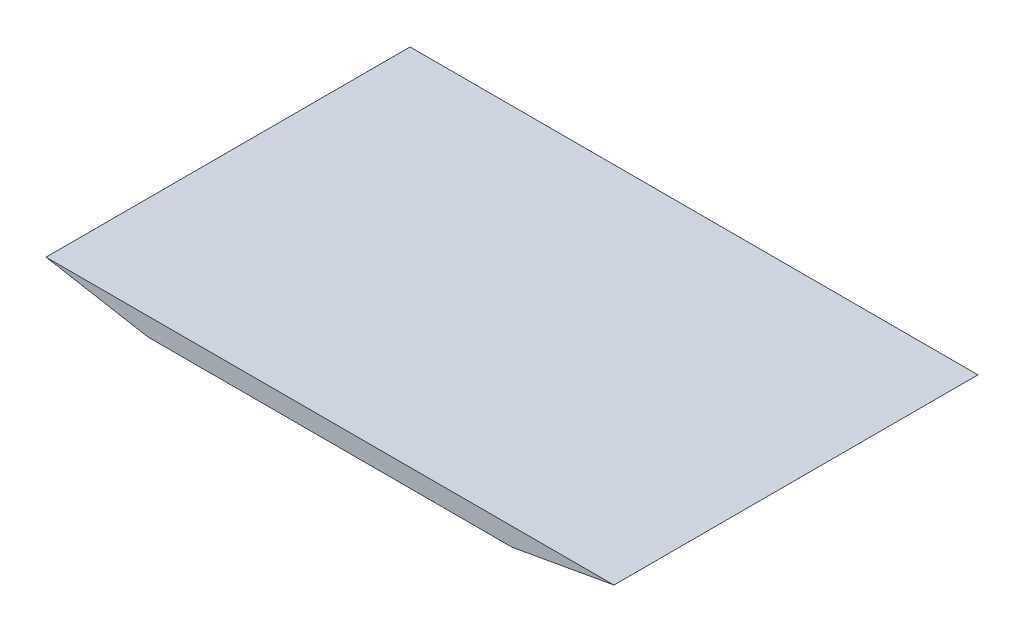
ISO-10303-21;
HEADER;
FILE_DESCRIPTION(('STEP AP214'),'2;1');
FILE_NAME('part.step','',(''),(''),'','','');
FILE_SCHEMA(('AUTOMOTIVE_DESIGN { 1 0 10303 214 1 1 1 1 }'));
ENDSEC;
DATA;
#1=APPLICATION_CONTEXT('core data for automotive mechanical design processes');
#2=APPLICATION_PROTOCOL_DEFINITION('international standard','automotive_design',2000,#1);
#3=PRODUCT_CONTEXT('',#1,'mechanical');
#4=PRODUCT('Part','Part','',(#3));
#5=PRODUCT_RELATED_PRODUCT_CATEGORY('part','',(#4));
#6=PRODUCT_DEFINITION_FORMATION('','',#4);
#7=PRODUCT_DEFINITION_CONTEXT('part definition',#1,'design');
#8=PRODUCT_DEFINITION('design','',#6,#7);
#9=PRODUCT_DEFINITION_SHAPE('','',#8);
#10=(LENGTH_UNIT() NAMED_UNIT(*) SI_UNIT(.MILLI.,.METRE.));
#11=(NAMED_UNIT(*) PLANE_ANGLE_UNIT() SI_UNIT($,.RADIAN.));
#12=(NAMED_UNIT(*) SI_UNIT($,.STERADIAN.) SOLID_ANGLE_UNIT());
#13=UNCERTAINTY_MEASURE_WITH_UNIT(LENGTH_MEASURE(1.E-05),#10,'distance_accuracy_value','');
#14=(GEOMETRIC_REPRESENTATION_CONTEXT(3) GLOBAL_UNCERTAINTY_ASSIGNED_CONTEXT((#13)) GLOBAL_UNIT_ASSIGNED_CONTEXT((#10,
#11,#12)) REPRESENTATION_CONTEXT('',''));
#15=CARTESIAN_POINT('',(0.,0.,0.));
#16=DIRECTION('',(0.,0.,1.));
#17=DIRECTION('',(1.,0.,0.));
#18=AXIS2_PLACEMENT_3D('',#15,#16,#17);
#19=CARTESIAN_POINT('',(28.,-5.00000000000001,100.));
#20=DIRECTION('',(0.175790638483658,0.984427575508482,0.));
#21=DIRECTION('',(-0.984427575508482,0.175790638483658,0.));
#22=AXIS2_PLACEMENT_3D('',#19,#20,#21);
#23=PLANE('',#22);
#24=DIRECTION('',(0.984427575508482,-0.175790638483658,0.));
#25=VECTOR('',#24,1.);
#26=CARTESIAN_POINT('',(28.,-5.00000000000001,0.));
#27=LINE('',#26,#25);
#28=CARTESIAN_POINT('',(0.,0.,0.));
#29=VERTEX_POINT('',#28);
#30=CARTESIAN_POINT('',(28.,-5.00000000000001,0.));
#31=VERTEX_POINT('',#30);
#32=EDGE_CURVE('E107',#29,#31,#27,.T.);
#33=ORIENTED_EDGE('',*,*,#32,.T.);
#34=DIRECTION('',(0.,0.,-1.));
#35=VECTOR('',#34,1.);
#36=CARTESIAN_POINT('',(28.,-5.00000000000001,100.));
#37=LINE('',#36,#35);
#38=CARTESIAN_POINT('',(28.,-5.00000000000001,100.));
#39=VERTEX_POINT('',#38);
#40=EDGE_CURVE('E11',#39,#31,#37,.T.);
#41=ORIENTED_EDGE('',*,*,#40,.F.);
#42=DIRECTION('',(0.984427575508482,-0.175790638483658,0.));
#43=VECTOR('',#42,1.);
#44=CARTESIAN_POINT('',(28.,-5.00000000000001,100.));
#45=LINE('',#44,#43);
#46=CARTESIAN_POINT('',(0.,0.,100.));
#47=VERTEX_POINT('',#46);
#48=EDGE_CURVE('E91',#47,#39,#45,.T.);
#49=ORIENTED_EDGE('',*,*,#48,.F.);
#50=DIRECTION('',(0.,0.,-1.));
#51=VECTOR('',#50,1.);
#52=CARTESIAN_POINT('',(0.,0.,100.));
#53=LINE('',#52,#51);
#54=EDGE_CURVE('E103',#47,#29,#53,.T.);
#55=ORIENTED_EDGE('',*,*,#54,.T.);
#56=EDGE_LOOP('',(#33,#41,#49,#55));
#57=FACE_BOUND('',#56,.T.);
#58=ADVANCED_FACE('F39',(#57),#23,.F.);
#59=CARTESIAN_POINT('',(128.,-5.,100.));
#60=DIRECTION('',(0.,1.,0.));
#61=DIRECTION('',(-1.,0.,0.));
#62=AXIS2_PLACEMENT_3D('',#59,#60,#61);
#63=PLANE('',#62);
#64=DIRECTION('',(1.,0.,0.));
#65=VECTOR('',#64,1.);
#66=CARTESIAN_POINT('',(128.,-5.,0.));
#67=LINE('',#66,#65);
#68=CARTESIAN_POINT('',(128.,-5.,0.));
#69=VERTEX_POINT('',#68);
#70=EDGE_CURVE('E96',#31,#69,#67,.T.);
#71=ORIENTED_EDGE('',*,*,#70,.T.);
#72=DIRECTION('',(0.,0.,-1.));
#73=VECTOR('',#72,1.);
#74=CARTESIAN_POINT('',(128.,-5.,100.));
#75=LINE('',#74,#73);
#76=CARTESIAN_POINT('',(128.,-5.,100.));
#77=VERTEX_POINT('',#76);
#78=EDGE_CURVE('E48',#77,#69,#75,.T.);
#79=ORIENTED_EDGE('',*,*,#78,.F.);
#80=DIRECTION('',(1.,0.,0.));
#81=VECTOR('',#80,1.);
#82=CARTESIAN_POINT('',(128.,-5.,100.));
#83=LINE('',#82,#81);
#84=EDGE_CURVE('E86',#39,#77,#83,.T.);
#85=ORIENTED_EDGE('',*,*,#84,.F.);
#86=ORIENTED_EDGE('',*,*,#40,.T.);
#87=EDGE_LOOP('',(#71,#79,#85,#86));
#88=FACE_BOUND('',#87,.T.);
#89=ADVANCED_FACE('F95',(#88),#63,.F.);
#90=CARTESIAN_POINT('',(156.,0.,100.));
#91=DIRECTION('',(-0.175790638483658,0.984427575508482,0.));
#92=DIRECTION('',(-0.984427575508482,-0.175790638483658,0.));
#93=AXIS2_PLACEMENT_3D('',#90,#91,#92);
#94=PLANE('',#93);
#95=DIRECTION('',(0.984427575508482,0.175790638483658,0.));
#96=VECTOR('',#95,1.);
#97=CARTESIAN_POINT('',(156.,0.,0.));
#98=LINE('',#97,#96);
#99=CARTESIAN_POINT('',(156.,0.,0.));
#100=VERTEX_POINT('',#99);
#101=EDGE_CURVE('E73',#69,#100,#98,.T.);
#102=ORIENTED_EDGE('',*,*,#101,.T.);
#103=DIRECTION('',(0.,0.,-1.));
#104=VECTOR('',#103,1.);
#105=CARTESIAN_POINT('',(156.,0.,100.));
#106=LINE('',#105,#104);
#107=CARTESIAN_POINT('',(156.,0.,100.));
#108=VERTEX_POINT('',#107);
#109=EDGE_CURVE('E98',#108,#100,#106,.T.);
#110=ORIENTED_EDGE('',*,*,#109,.F.);
#111=DIRECTION('',(0.984427575508482,0.175790638483658,0.));
#112=VECTOR('',#111,1.);
#113=CARTESIAN_POINT('',(156.,0.,100.));
#114=LINE('',#113,#112);
#115=EDGE_CURVE('E89',#77,#108,#114,.T.);
#116=ORIENTED_EDGE('',*,*,#115,.F.);
#117=ORIENTED_EDGE('',*,*,#78,.T.);
#118=EDGE_LOOP('',(#102,#110,#116,#117));
#119=FACE_BOUND('',#118,.T.);
#120=ADVANCED_FACE('F99',(#119),#94,.F.);
#121=CARTESIAN_POINT('',(0.,0.,100.));
#122=DIRECTION('',(0.,-1.,0.));
#123=DIRECTION('',(0.,0.,-1.));
#124=AXIS2_PLACEMENT_3D('',#121,#122,#123);
#125=PLANE('',#124);
#126=DIRECTION('',(-1.,0.,0.));
#127=VECTOR('',#126,1.);
#128=CARTESIAN_POINT('',(0.,0.,0.));
#129=LINE('',#128,#127);
#130=EDGE_CURVE('E79',#100,#29,#129,.T.);
#131=ORIENTED_EDGE('',*,*,#130,.T.);
#132=ORIENTED_EDGE('',*,*,#54,.F.);
#133=DIRECTION('',(-1.,0.,0.));
#134=VECTOR('',#133,1.);
#135=CARTESIAN_POINT('',(0.,0.,100.));
#136=LINE('',#135,#134);
#137=EDGE_CURVE('E56',#108,#47,#136,.T.);
#138=ORIENTED_EDGE('',*,*,#137,.F.);
#139=ORIENTED_EDGE('',*,*,#109,.T.);
#140=EDGE_LOOP('',(#131,#132,#138,#139));
#141=FACE_BOUND('',#140,.T.);
#142=ADVANCED_FACE('F120',(#141),#125,.F.);
#143=CARTESIAN_POINT('',(0.,0.,100.));
#144=DIRECTION('',(0.,0.,1.));
#145=DIRECTION('',(1.,0.,0.));
#146=AXIS2_PLACEMENT_3D('',#143,#144,#145);
#147=PLANE('',#146);
#148=ORIENTED_EDGE('',*,*,#48,.T.);
#149=ORIENTED_EDGE('',*,*,#84,.T.);
#150=ORIENTED_EDGE('',*,*,#115,.T.);
#151=ORIENTED_EDGE('',*,*,#137,.T.);
#152=EDGE_LOOP('',(#148,#149,#150,#151));
#153=FACE_BOUND('',#152,.T.);
#154=ADVANCED_FACE('F87',(#153),#147,.T.);
#155=CARTESIAN_POINT('',(0.,0.,0.));
#156=DIRECTION('',(0.,0.,1.));
#157=DIRECTION('',(1.,0.,0.));
#158=AXIS2_PLACEMENT_3D('',#155,#156,#157);
#159=PLANE('',#158);
#160=ORIENTED_EDGE('',*,*,#32,.F.);
#161=ORIENTED_EDGE('',*,*,#130,.F.);
#162=ORIENTED_EDGE('',*,*,#101,.F.);
#163=ORIENTED_EDGE('',*,*,#70,.F.);
#164=EDGE_LOOP('',(#160,#161,#162,#163));
#165=FACE_BOUND('',#164,.T.);
#166=ADVANCED_FACE('F123',(#165),#159,.F.);
#167=CLOSED_SHELL('',(#58,#89,#120,#142,#154,#166));
#168=MANIFOLD_SOLID_BREP('B2',#167);
#169=ADVANCED_BREP_SHAPE_REPRESENTATION('',(#18,#168),#14);
#170=SHAPE_DEFINITION_REPRESENTATION(#9,#169);
ENDSEC;
END-ISO-10303-21;
